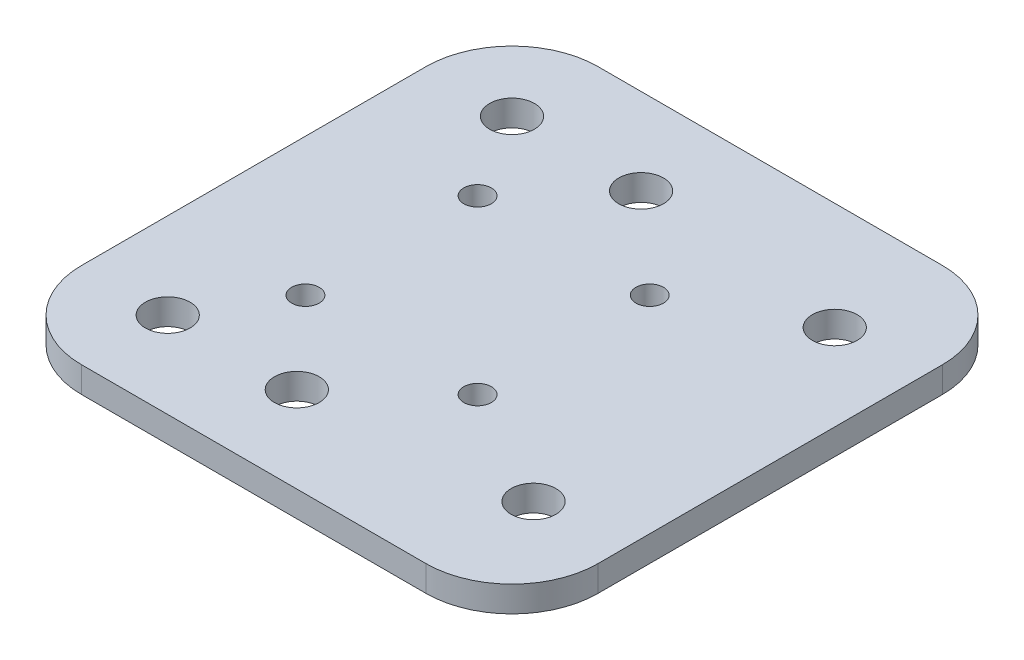
ISO-10303-21;
HEADER;
FILE_DESCRIPTION(('STEP AP214'),'2;1');
FILE_NAME('part.step','',(''),(''),'','','');
FILE_SCHEMA(('AUTOMOTIVE_DESIGN { 1 0 10303 214 1 1 1 1 }'));
ENDSEC;
DATA;
#1=APPLICATION_CONTEXT('core data for automotive mechanical design processes');
#2=APPLICATION_PROTOCOL_DEFINITION('international standard','automotive_design',2000,#1);
#3=PRODUCT_CONTEXT('',#1,'mechanical');
#4=PRODUCT('Part','Part','',(#3));
#5=PRODUCT_RELATED_PRODUCT_CATEGORY('part','',(#4));
#6=PRODUCT_DEFINITION_FORMATION('','',#4);
#7=PRODUCT_DEFINITION_CONTEXT('part definition',#1,'design');
#8=PRODUCT_DEFINITION('design','',#6,#7);
#9=PRODUCT_DEFINITION_SHAPE('','',#8);
#10=(LENGTH_UNIT() NAMED_UNIT(*) SI_UNIT(.MILLI.,.METRE.));
#11=(NAMED_UNIT(*) PLANE_ANGLE_UNIT() SI_UNIT($,.RADIAN.));
#12=(NAMED_UNIT(*) SI_UNIT($,.STERADIAN.) SOLID_ANGLE_UNIT());
#13=UNCERTAINTY_MEASURE_WITH_UNIT(LENGTH_MEASURE(1.E-05),#10,'distance_accuracy_value','');
#14=(GEOMETRIC_REPRESENTATION_CONTEXT(3) GLOBAL_UNCERTAINTY_ASSIGNED_CONTEXT((#13)) GLOBAL_UNIT_ASSIGNED_CONTEXT((#10,
#11,#12)) REPRESENTATION_CONTEXT('',''));
#15=CARTESIAN_POINT('',(0.,0.,0.));
#16=DIRECTION('',(0.,0.,1.));
#17=DIRECTION('',(1.,0.,0.));
#18=AXIS2_PLACEMENT_3D('',#15,#16,#17);
#19=CARTESIAN_POINT('',(0.,3.,-30.));
#20=DIRECTION('',(0.,0.,1.));
#21=DIRECTION('',(1.,0.,0.));
#22=AXIS2_PLACEMENT_3D('',#19,#20,#21);
#23=PLANE('',#22);
#24=DIRECTION('',(-1.,0.,0.));
#25=VECTOR('',#24,1.);
#26=CARTESIAN_POINT('',(21.7157287525381,3.,-30.));
#27=LINE('',#26,#25);
#28=CARTESIAN_POINT('',(50.,3.,-30.));
#29=VERTEX_POINT('',#28);
#30=CARTESIAN_POINT('',(10.,3.,-30.));
#31=VERTEX_POINT('',#30);
#32=EDGE_CURVE('E130',#29,#31,#27,.T.);
#33=ORIENTED_EDGE('',*,*,#32,.F.);
#34=DIRECTION('',(0.,-1.,0.));
#35=VECTOR('',#34,1.);
#36=CARTESIAN_POINT('',(50.,3.,-30.));
#37=LINE('',#36,#35);
#38=CARTESIAN_POINT('',(50.,0.,-30.));
#39=VERTEX_POINT('',#38);
#40=EDGE_CURVE('E156',#29,#39,#37,.T.);
#41=ORIENTED_EDGE('',*,*,#40,.T.);
#42=DIRECTION('',(-1.,0.,0.));
#43=VECTOR('',#42,1.);
#44=CARTESIAN_POINT('',(0.,0.,-30.));
#45=LINE('',#44,#43);
#46=CARTESIAN_POINT('',(10.,0.,-30.));
#47=VERTEX_POINT('',#46);
#48=EDGE_CURVE('E164',#39,#47,#45,.T.);
#49=ORIENTED_EDGE('',*,*,#48,.T.);
#50=DIRECTION('',(0.,-1.,0.));
#51=VECTOR('',#50,1.);
#52=CARTESIAN_POINT('',(10.,3.,-30.));
#53=LINE('',#52,#51);
#54=EDGE_CURVE('E154',#47,#31,#53,.F.);
#55=ORIENTED_EDGE('',*,*,#54,.T.);
#56=EDGE_LOOP('',(#33,#41,#49,#55));
#57=FACE_BOUND('',#56,.T.);
#58=ADVANCED_FACE('F39',(#57),#23,.F.);
#59=CARTESIAN_POINT('',(0.,3.,30.));
#60=DIRECTION('',(1.,0.,0.));
#61=DIRECTION('',(0.,0.,-1.));
#62=AXIS2_PLACEMENT_3D('',#59,#60,#61);
#63=PLANE('',#62);
#64=DIRECTION('',(0.,0.,1.));
#65=VECTOR('',#64,1.);
#66=CARTESIAN_POINT('',(0.,0.,30.));
#67=LINE('',#66,#65);
#68=CARTESIAN_POINT('',(0.,0.,-20.));
#69=VERTEX_POINT('',#68);
#70=CARTESIAN_POINT('',(0.,0.,20.));
#71=VERTEX_POINT('',#70);
#72=EDGE_CURVE('E135',#69,#71,#67,.T.);
#73=ORIENTED_EDGE('',*,*,#72,.T.);
#74=DIRECTION('',(0.,-1.,0.));
#75=VECTOR('',#74,1.);
#76=CARTESIAN_POINT('',(0.,3.,20.));
#77=LINE('',#76,#75);
#78=CARTESIAN_POINT('',(0.,3.,20.));
#79=VERTEX_POINT('',#78);
#80=EDGE_CURVE('E11',#71,#79,#77,.F.);
#81=ORIENTED_EDGE('',*,*,#80,.T.);
#82=DIRECTION('',(0.,0.,1.));
#83=VECTOR('',#82,1.);
#84=CARTESIAN_POINT('',(0.,3.,30.));
#85=LINE('',#84,#83);
#86=CARTESIAN_POINT('',(0.,3.,-20.));
#87=VERTEX_POINT('',#86);
#88=EDGE_CURVE('E133',#87,#79,#85,.T.);
#89=ORIENTED_EDGE('',*,*,#88,.F.);
#90=DIRECTION('',(0.,-1.,0.));
#91=VECTOR('',#90,1.);
#92=CARTESIAN_POINT('',(0.,3.,-20.));
#93=LINE('',#92,#91);
#94=EDGE_CURVE('E47',#87,#69,#93,.T.);
#95=ORIENTED_EDGE('',*,*,#94,.T.);
#96=EDGE_LOOP('',(#73,#81,#89,#95));
#97=FACE_BOUND('',#96,.T.);
#98=ADVANCED_FACE('F161',(#97),#63,.F.);
#99=CARTESIAN_POINT('',(21.7157287525381,3.,30.));
#100=DIRECTION('',(0.,0.,-1.));
#101=DIRECTION('',(-1.,0.,0.));
#102=AXIS2_PLACEMENT_3D('',#99,#100,#101);
#103=PLANE('',#102);
#104=DIRECTION('',(1.,0.,0.));
#105=VECTOR('',#104,1.);
#106=CARTESIAN_POINT('',(21.7157287525381,0.,30.));
#107=LINE('',#106,#105);
#108=CARTESIAN_POINT('',(10.,0.,30.));
#109=VERTEX_POINT('',#108);
#110=CARTESIAN_POINT('',(50.,0.,30.));
#111=VERTEX_POINT('',#110);
#112=EDGE_CURVE('E131',#109,#111,#107,.T.);
#113=ORIENTED_EDGE('',*,*,#112,.T.);
#114=DIRECTION('',(0.,-1.,0.));
#115=VECTOR('',#114,1.);
#116=CARTESIAN_POINT('',(50.,3.,30.));
#117=LINE('',#116,#115);
#118=CARTESIAN_POINT('',(50.,3.,30.));
#119=VERTEX_POINT('',#118);
#120=EDGE_CURVE('E109',#111,#119,#117,.F.);
#121=ORIENTED_EDGE('',*,*,#120,.T.);
#122=DIRECTION('',(1.,0.,0.));
#123=VECTOR('',#122,1.);
#124=CARTESIAN_POINT('',(0.,3.,30.));
#125=LINE('',#124,#123);
#126=CARTESIAN_POINT('',(10.,3.,30.));
#127=VERTEX_POINT('',#126);
#128=EDGE_CURVE('E169',#127,#119,#125,.T.);
#129=ORIENTED_EDGE('',*,*,#128,.F.);
#130=DIRECTION('',(0.,-1.,0.));
#131=VECTOR('',#130,1.);
#132=CARTESIAN_POINT('',(10.,3.,30.));
#133=LINE('',#132,#131);
#134=EDGE_CURVE('E114',#127,#109,#133,.T.);
#135=ORIENTED_EDGE('',*,*,#134,.T.);
#136=EDGE_LOOP('',(#113,#121,#129,#135));
#137=FACE_BOUND('',#136,.T.);
#138=ADVANCED_FACE('F253',(#137),#103,.F.);
#139=CARTESIAN_POINT('',(60.,3.,-30.));
#140=DIRECTION('',(-1.,0.,0.));
#141=DIRECTION('',(0.,0.,1.));
#142=AXIS2_PLACEMENT_3D('',#139,#140,#141);
#143=PLANE('',#142);
#144=DIRECTION('',(0.,0.,-1.));
#145=VECTOR('',#144,1.);
#146=CARTESIAN_POINT('',(60.,3.,-30.));
#147=LINE('',#146,#145);
#148=CARTESIAN_POINT('',(60.,3.,20.));
#149=VERTEX_POINT('',#148);
#150=CARTESIAN_POINT('',(60.,3.,-20.));
#151=VERTEX_POINT('',#150);
#152=EDGE_CURVE('E124',#149,#151,#147,.T.);
#153=ORIENTED_EDGE('',*,*,#152,.F.);
#154=DIRECTION('',(0.,-1.,0.));
#155=VECTOR('',#154,1.);
#156=CARTESIAN_POINT('',(60.,3.,20.));
#157=LINE('',#156,#155);
#158=CARTESIAN_POINT('',(60.,0.,20.));
#159=VERTEX_POINT('',#158);
#160=EDGE_CURVE('E108',#149,#159,#157,.T.);
#161=ORIENTED_EDGE('',*,*,#160,.T.);
#162=DIRECTION('',(0.,0.,-1.));
#163=VECTOR('',#162,1.);
#164=CARTESIAN_POINT('',(60.,0.,-30.));
#165=LINE('',#164,#163);
#166=CARTESIAN_POINT('',(60.,0.,-20.));
#167=VERTEX_POINT('',#166);
#168=EDGE_CURVE('E121',#159,#167,#165,.T.);
#169=ORIENTED_EDGE('',*,*,#168,.T.);
#170=DIRECTION('',(0.,-1.,0.));
#171=VECTOR('',#170,1.);
#172=CARTESIAN_POINT('',(60.,3.,-20.));
#173=LINE('',#172,#171);
#174=EDGE_CURVE('E126',#167,#151,#173,.F.);
#175=ORIENTED_EDGE('',*,*,#174,.T.);
#176=EDGE_LOOP('',(#153,#161,#169,#175));
#177=FACE_BOUND('',#176,.T.);
#178=ADVANCED_FACE('F120',(#177),#143,.F.);
#179=CARTESIAN_POINT('',(0.,3.,0.));
#180=DIRECTION('',(0.,-1.,0.));
#181=DIRECTION('',(0.,0.,-1.));
#182=AXIS2_PLACEMENT_3D('',#179,#180,#181);
#183=PLANE('',#182);
#184=CARTESIAN_POINT('',(25.,3.,20.));
#185=DIRECTION('',(0.,1.,0.));
#186=DIRECTION('',(0.,0.,1.));
#187=AXIS2_PLACEMENT_3D('',#184,#185,#186);
#188=CIRCLE('',#187,2.6);
#189=CARTESIAN_POINT('',(25.,3.,22.6));
#190=VERTEX_POINT('',#189);
#191=EDGE_CURVE('E203',#190,#190,#188,.T.);
#192=ORIENTED_EDGE('',*,*,#191,.F.);
#193=EDGE_LOOP('',(#192));
#194=FACE_BOUND('',#193,.T.);
#195=CARTESIAN_POINT('',(25.,3.,-20.));
#196=DIRECTION('',(0.,1.,0.));
#197=DIRECTION('',(0.,0.,1.));
#198=AXIS2_PLACEMENT_3D('',#195,#196,#197);
#199=CIRCLE('',#198,2.6);
#200=CARTESIAN_POINT('',(25.,3.,-17.4));
#201=VERTEX_POINT('',#200);
#202=EDGE_CURVE('E210',#201,#201,#199,.T.);
#203=ORIENTED_EDGE('',*,*,#202,.F.);
#204=EDGE_LOOP('',(#203));
#205=FACE_BOUND('',#204,.T.);
#206=CARTESIAN_POINT('',(10.,3.,20.));
#207=DIRECTION('',(0.,1.,0.));
#208=DIRECTION('',(0.,0.,1.));
#209=AXIS2_PLACEMENT_3D('',#206,#207,#208);
#210=CIRCLE('',#209,2.6);
#211=CARTESIAN_POINT('',(10.,3.,22.6));
#212=VERTEX_POINT('',#211);
#213=EDGE_CURVE('E216',#212,#212,#210,.T.);
#214=ORIENTED_EDGE('',*,*,#213,.F.);
#215=EDGE_LOOP('',(#214));
#216=FACE_BOUND('',#215,.T.);
#217=CARTESIAN_POINT('',(10.,3.,-20.));
#218=DIRECTION('',(0.,1.,0.));
#219=DIRECTION('',(0.,0.,1.));
#220=AXIS2_PLACEMENT_3D('',#217,#218,#219);
#221=CIRCLE('',#220,2.6);
#222=CARTESIAN_POINT('',(10.,3.,-17.4));
#223=VERTEX_POINT('',#222);
#224=EDGE_CURVE('E222',#223,#223,#221,.T.);
#225=ORIENTED_EDGE('',*,*,#224,.F.);
#226=EDGE_LOOP('',(#225));
#227=FACE_BOUND('',#226,.T.);
#228=CARTESIAN_POINT('',(36.,3.,-10.));
#229=DIRECTION('',(0.,1.,0.));
#230=DIRECTION('',(0.,0.,1.));
#231=AXIS2_PLACEMENT_3D('',#228,#229,#230);
#232=CIRCLE('',#231,1.6);
#233=CARTESIAN_POINT('',(36.,3.,-8.4));
#234=VERTEX_POINT('',#233);
#235=EDGE_CURVE('E186',#234,#234,#232,.T.);
#236=ORIENTED_EDGE('',*,*,#235,.F.);
#237=EDGE_LOOP('',(#236));
#238=FACE_BOUND('',#237,.T.);
#239=CARTESIAN_POINT('',(36.,3.,10.));
#240=DIRECTION('',(0.,1.,0.));
#241=DIRECTION('',(0.,0.,-1.));
#242=AXIS2_PLACEMENT_3D('',#239,#240,#241);
#243=CIRCLE('',#242,1.6);
#244=CARTESIAN_POINT('',(36.,3.,8.4));
#245=VERTEX_POINT('',#244);
#246=EDGE_CURVE('E179',#245,#245,#243,.T.);
#247=ORIENTED_EDGE('',*,*,#246,.F.);
#248=EDGE_LOOP('',(#247));
#249=FACE_BOUND('',#248,.T.);
#250=CARTESIAN_POINT('',(16.,3.,10.));
#251=DIRECTION('',(0.,1.,0.));
#252=DIRECTION('',(0.,0.,-1.));
#253=AXIS2_PLACEMENT_3D('',#250,#251,#252);
#254=CIRCLE('',#253,1.6);
#255=CARTESIAN_POINT('',(16.,3.,8.4));
#256=VERTEX_POINT('',#255);
#257=EDGE_CURVE('E198',#256,#256,#254,.T.);
#258=ORIENTED_EDGE('',*,*,#257,.F.);
#259=EDGE_LOOP('',(#258));
#260=FACE_BOUND('',#259,.T.);
#261=CARTESIAN_POINT('',(50.,3.,-17.5));
#262=DIRECTION('',(0.,1.,0.));
#263=DIRECTION('',(0.,0.,1.));
#264=AXIS2_PLACEMENT_3D('',#261,#262,#263);
#265=CIRCLE('',#264,2.6);
#266=CARTESIAN_POINT('',(50.,3.,-14.9));
#267=VERTEX_POINT('',#266);
#268=EDGE_CURVE('E191',#267,#267,#265,.T.);
#269=ORIENTED_EDGE('',*,*,#268,.F.);
#270=EDGE_LOOP('',(#269));
#271=FACE_BOUND('',#270,.T.);
#272=CARTESIAN_POINT('',(50.,3.,17.5));
#273=DIRECTION('',(0.,1.,0.));
#274=DIRECTION('',(0.,0.,1.));
#275=AXIS2_PLACEMENT_3D('',#272,#273,#274);
#276=CIRCLE('',#275,2.6);
#277=CARTESIAN_POINT('',(50.,3.,20.1));
#278=VERTEX_POINT('',#277);
#279=EDGE_CURVE('E227',#278,#278,#276,.T.);
#280=ORIENTED_EDGE('',*,*,#279,.F.);
#281=EDGE_LOOP('',(#280));
#282=FACE_BOUND('',#281,.T.);
#283=CARTESIAN_POINT('',(16.,3.,-10.));
#284=DIRECTION('',(0.,1.,0.));
#285=DIRECTION('',(0.,0.,1.));
#286=AXIS2_PLACEMENT_3D('',#283,#284,#285);
#287=CIRCLE('',#286,1.6);
#288=CARTESIAN_POINT('',(16.,3.,-8.4));
#289=VERTEX_POINT('',#288);
#290=EDGE_CURVE('E173',#289,#289,#287,.T.);
#291=ORIENTED_EDGE('',*,*,#290,.F.);
#292=EDGE_LOOP('',(#291));
#293=FACE_BOUND('',#292,.T.);
#294=ORIENTED_EDGE('',*,*,#128,.T.);
#295=CARTESIAN_POINT('',(50.,3.,20.));
#296=DIRECTION('',(0.,-1.,0.));
#297=DIRECTION('',(0.,0.,-1.));
#298=AXIS2_PLACEMENT_3D('',#295,#296,#297);
#299=CIRCLE('',#298,10.);
#300=EDGE_CURVE('E152',#119,#149,#299,.F.);
#301=ORIENTED_EDGE('',*,*,#300,.T.);
#302=ORIENTED_EDGE('',*,*,#152,.T.);
#303=CARTESIAN_POINT('',(50.,3.,-20.));
#304=DIRECTION('',(0.,-1.,0.));
#305=DIRECTION('',(0.,0.,-1.));
#306=AXIS2_PLACEMENT_3D('',#303,#304,#305);
#307=CIRCLE('',#306,10.);
#308=EDGE_CURVE('E150',#151,#29,#307,.F.);
#309=ORIENTED_EDGE('',*,*,#308,.T.);
#310=ORIENTED_EDGE('',*,*,#32,.T.);
#311=CARTESIAN_POINT('',(10.,3.,-20.));
#312=DIRECTION('',(0.,-1.,0.));
#313=DIRECTION('',(0.,0.,-1.));
#314=AXIS2_PLACEMENT_3D('',#311,#312,#313);
#315=CIRCLE('',#314,10.);
#316=EDGE_CURVE('E59',#31,#87,#315,.F.);
#317=ORIENTED_EDGE('',*,*,#316,.T.);
#318=ORIENTED_EDGE('',*,*,#88,.T.);
#319=CARTESIAN_POINT('',(10.,3.,20.));
#320=DIRECTION('',(0.,-1.,0.));
#321=DIRECTION('',(0.,0.,-1.));
#322=AXIS2_PLACEMENT_3D('',#319,#320,#321);
#323=CIRCLE('',#322,10.);
#324=EDGE_CURVE('E148',#79,#127,#323,.F.);
#325=ORIENTED_EDGE('',*,*,#324,.T.);
#326=EDGE_LOOP('',(#294,#301,#302,#309,#310,#317,#318,#325));
#327=FACE_BOUND('',#326,.T.);
#328=ADVANCED_FACE('F243',(#194,#205,#216,#227,#238,#249,#260,#271,#282,#293,#327),#183,.F.);
#329=CARTESIAN_POINT('',(0.,0.,0.));
#330=DIRECTION('',(0.,-1.,0.));
#331=DIRECTION('',(0.,0.,-1.));
#332=AXIS2_PLACEMENT_3D('',#329,#330,#331);
#333=PLANE('',#332);
#334=CARTESIAN_POINT('',(25.,0.,20.));
#335=DIRECTION('',(0.,1.,0.));
#336=DIRECTION('',(0.,0.,1.));
#337=AXIS2_PLACEMENT_3D('',#334,#335,#336);
#338=CIRCLE('',#337,2.6);
#339=CARTESIAN_POINT('',(25.,0.,22.6));
#340=VERTEX_POINT('',#339);
#341=EDGE_CURVE('E206',#340,#340,#338,.T.);
#342=ORIENTED_EDGE('',*,*,#341,.T.);
#343=EDGE_LOOP('',(#342));
#344=FACE_BOUND('',#343,.T.);
#345=CARTESIAN_POINT('',(25.,0.,-20.));
#346=DIRECTION('',(0.,1.,0.));
#347=DIRECTION('',(0.,0.,1.));
#348=AXIS2_PLACEMENT_3D('',#345,#346,#347);
#349=CIRCLE('',#348,2.6);
#350=CARTESIAN_POINT('',(25.,0.,-17.4));
#351=VERTEX_POINT('',#350);
#352=EDGE_CURVE('E213',#351,#351,#349,.T.);
#353=ORIENTED_EDGE('',*,*,#352,.T.);
#354=EDGE_LOOP('',(#353));
#355=FACE_BOUND('',#354,.T.);
#356=CARTESIAN_POINT('',(10.,0.,20.));
#357=DIRECTION('',(0.,1.,0.));
#358=DIRECTION('',(0.,0.,1.));
#359=AXIS2_PLACEMENT_3D('',#356,#357,#358);
#360=CIRCLE('',#359,2.6);
#361=CARTESIAN_POINT('',(10.,0.,22.6));
#362=VERTEX_POINT('',#361);
#363=EDGE_CURVE('E219',#362,#362,#360,.T.);
#364=ORIENTED_EDGE('',*,*,#363,.T.);
#365=EDGE_LOOP('',(#364));
#366=FACE_BOUND('',#365,.T.);
#367=CARTESIAN_POINT('',(10.,0.,-20.));
#368=DIRECTION('',(0.,1.,0.));
#369=DIRECTION('',(0.,0.,1.));
#370=AXIS2_PLACEMENT_3D('',#367,#368,#369);
#371=CIRCLE('',#370,2.6);
#372=CARTESIAN_POINT('',(10.,0.,-17.4));
#373=VERTEX_POINT('',#372);
#374=EDGE_CURVE('E195',#373,#373,#371,.T.);
#375=ORIENTED_EDGE('',*,*,#374,.T.);
#376=EDGE_LOOP('',(#375));
#377=FACE_BOUND('',#376,.T.);
#378=CARTESIAN_POINT('',(36.,0.,-10.));
#379=DIRECTION('',(0.,1.,0.));
#380=DIRECTION('',(0.,0.,1.));
#381=AXIS2_PLACEMENT_3D('',#378,#379,#380);
#382=CIRCLE('',#381,1.6);
#383=CARTESIAN_POINT('',(36.,0.,-8.4));
#384=VERTEX_POINT('',#383);
#385=EDGE_CURVE('E176',#384,#384,#382,.T.);
#386=ORIENTED_EDGE('',*,*,#385,.T.);
#387=EDGE_LOOP('',(#386));
#388=FACE_BOUND('',#387,.T.);
#389=CARTESIAN_POINT('',(36.,0.,10.));
#390=DIRECTION('',(0.,1.,0.));
#391=DIRECTION('',(0.,0.,-1.));
#392=AXIS2_PLACEMENT_3D('',#389,#390,#391);
#393=CIRCLE('',#392,1.6);
#394=CARTESIAN_POINT('',(36.,0.,8.4));
#395=VERTEX_POINT('',#394);
#396=EDGE_CURVE('E182',#395,#395,#393,.T.);
#397=ORIENTED_EDGE('',*,*,#396,.T.);
#398=EDGE_LOOP('',(#397));
#399=FACE_BOUND('',#398,.T.);
#400=CARTESIAN_POINT('',(16.,0.,10.));
#401=DIRECTION('',(0.,1.,0.));
#402=DIRECTION('',(0.,0.,-1.));
#403=AXIS2_PLACEMENT_3D('',#400,#401,#402);
#404=CIRCLE('',#403,1.6);
#405=CARTESIAN_POINT('',(16.,0.,8.4));
#406=VERTEX_POINT('',#405);
#407=EDGE_CURVE('E183',#406,#406,#404,.T.);
#408=ORIENTED_EDGE('',*,*,#407,.T.);
#409=EDGE_LOOP('',(#408));
#410=FACE_BOUND('',#409,.T.);
#411=CARTESIAN_POINT('',(50.,0.,-17.5));
#412=DIRECTION('',(0.,1.,0.));
#413=DIRECTION('',(0.,0.,1.));
#414=AXIS2_PLACEMENT_3D('',#411,#412,#413);
#415=CIRCLE('',#414,2.6);
#416=CARTESIAN_POINT('',(50.,0.,-14.9));
#417=VERTEX_POINT('',#416);
#418=EDGE_CURVE('E194',#417,#417,#415,.T.);
#419=ORIENTED_EDGE('',*,*,#418,.T.);
#420=EDGE_LOOP('',(#419));
#421=FACE_BOUND('',#420,.T.);
#422=CARTESIAN_POINT('',(50.,0.,17.5));
#423=DIRECTION('',(0.,1.,0.));
#424=DIRECTION('',(0.,0.,1.));
#425=AXIS2_PLACEMENT_3D('',#422,#423,#424);
#426=CIRCLE('',#425,2.6);
#427=CARTESIAN_POINT('',(50.,0.,20.1));
#428=VERTEX_POINT('',#427);
#429=EDGE_CURVE('E207',#428,#428,#426,.T.);
#430=ORIENTED_EDGE('',*,*,#429,.T.);
#431=EDGE_LOOP('',(#430));
#432=FACE_BOUND('',#431,.T.);
#433=CARTESIAN_POINT('',(16.,0.,-10.));
#434=DIRECTION('',(0.,1.,0.));
#435=DIRECTION('',(0.,0.,1.));
#436=AXIS2_PLACEMENT_3D('',#433,#434,#435);
#437=CIRCLE('',#436,1.6);
#438=CARTESIAN_POINT('',(16.,0.,-8.4));
#439=VERTEX_POINT('',#438);
#440=EDGE_CURVE('E165',#439,#439,#437,.T.);
#441=ORIENTED_EDGE('',*,*,#440,.T.);
#442=EDGE_LOOP('',(#441));
#443=FACE_BOUND('',#442,.T.);
#444=ORIENTED_EDGE('',*,*,#168,.F.);
#445=CARTESIAN_POINT('',(50.,0.,20.));
#446=DIRECTION('',(0.,-1.,0.));
#447=DIRECTION('',(0.,0.,-1.));
#448=AXIS2_PLACEMENT_3D('',#445,#446,#447);
#449=CIRCLE('',#448,10.);
#450=EDGE_CURVE('E104',#159,#111,#449,.T.);
#451=ORIENTED_EDGE('',*,*,#450,.T.);
#452=ORIENTED_EDGE('',*,*,#112,.F.);
#453=CARTESIAN_POINT('',(10.,0.,20.));
#454=DIRECTION('',(0.,-1.,0.));
#455=DIRECTION('',(0.,0.,-1.));
#456=AXIS2_PLACEMENT_3D('',#453,#454,#455);
#457=CIRCLE('',#456,10.);
#458=EDGE_CURVE('E141',#109,#71,#457,.T.);
#459=ORIENTED_EDGE('',*,*,#458,.T.);
#460=ORIENTED_EDGE('',*,*,#72,.F.);
#461=CARTESIAN_POINT('',(10.,0.,-20.));
#462=DIRECTION('',(0.,-1.,0.));
#463=DIRECTION('',(0.,0.,-1.));
#464=AXIS2_PLACEMENT_3D('',#461,#462,#463);
#465=CIRCLE('',#464,10.);
#466=EDGE_CURVE('E125',#69,#47,#465,.T.);
#467=ORIENTED_EDGE('',*,*,#466,.T.);
#468=ORIENTED_EDGE('',*,*,#48,.F.);
#469=CARTESIAN_POINT('',(50.,0.,-20.));
#470=DIRECTION('',(0.,-1.,0.));
#471=DIRECTION('',(0.,0.,-1.));
#472=AXIS2_PLACEMENT_3D('',#469,#470,#471);
#473=CIRCLE('',#472,10.);
#474=EDGE_CURVE('E115',#39,#167,#473,.T.);
#475=ORIENTED_EDGE('',*,*,#474,.T.);
#476=EDGE_LOOP('',(#444,#451,#452,#459,#460,#467,#468,#475));
#477=FACE_BOUND('',#476,.T.);
#478=ADVANCED_FACE('F128',(#344,#355,#366,#377,#388,#399,#410,#421,#432,#443,#477),#333,.T.);
#479=CARTESIAN_POINT('',(16.,0.,-10.));
#480=DIRECTION('',(0.,1.,0.));
#481=DIRECTION('',(0.,0.,1.));
#482=AXIS2_PLACEMENT_3D('',#479,#480,#481);
#483=CYLINDRICAL_SURFACE('',#482,1.6);
#484=ORIENTED_EDGE('',*,*,#440,.F.);
#485=EDGE_LOOP('',(#484));
#486=FACE_BOUND('',#485,.T.);
#487=ORIENTED_EDGE('',*,*,#290,.T.);
#488=EDGE_LOOP('',(#487));
#489=FACE_BOUND('',#488,.T.);
#490=ADVANCED_FACE('F239',(#486,#489),#483,.F.);
#491=CARTESIAN_POINT('',(50.,0.,17.5));
#492=DIRECTION('',(0.,1.,0.));
#493=DIRECTION('',(0.,0.,1.));
#494=AXIS2_PLACEMENT_3D('',#491,#492,#493);
#495=CYLINDRICAL_SURFACE('',#494,2.6);
#496=ORIENTED_EDGE('',*,*,#429,.F.);
#497=EDGE_LOOP('',(#496));
#498=FACE_BOUND('',#497,.T.);
#499=ORIENTED_EDGE('',*,*,#279,.T.);
#500=EDGE_LOOP('',(#499));
#501=FACE_BOUND('',#500,.T.);
#502=ADVANCED_FACE('F235',(#498,#501),#495,.F.);
#503=CARTESIAN_POINT('',(50.,0.,-17.5));
#504=DIRECTION('',(0.,1.,0.));
#505=DIRECTION('',(0.,0.,1.));
#506=AXIS2_PLACEMENT_3D('',#503,#504,#505);
#507=CYLINDRICAL_SURFACE('',#506,2.6);
#508=ORIENTED_EDGE('',*,*,#418,.F.);
#509=EDGE_LOOP('',(#508));
#510=FACE_BOUND('',#509,.T.);
#511=ORIENTED_EDGE('',*,*,#268,.T.);
#512=EDGE_LOOP('',(#511));
#513=FACE_BOUND('',#512,.T.);
#514=ADVANCED_FACE('F238',(#510,#513),#507,.F.);
#515=CARTESIAN_POINT('',(16.,0.,10.));
#516=DIRECTION('',(0.,1.,0.));
#517=DIRECTION('',(0.,0.,1.));
#518=AXIS2_PLACEMENT_3D('',#515,#516,#517);
#519=CYLINDRICAL_SURFACE('',#518,1.6);
#520=ORIENTED_EDGE('',*,*,#407,.F.);
#521=EDGE_LOOP('',(#520));
#522=FACE_BOUND('',#521,.T.);
#523=ORIENTED_EDGE('',*,*,#257,.T.);
#524=EDGE_LOOP('',(#523));
#525=FACE_BOUND('',#524,.T.);
#526=ADVANCED_FACE('F293',(#522,#525),#519,.F.);
#527=CARTESIAN_POINT('',(36.,0.,10.));
#528=DIRECTION('',(0.,1.,0.));
#529=DIRECTION('',(0.,0.,1.));
#530=AXIS2_PLACEMENT_3D('',#527,#528,#529);
#531=CYLINDRICAL_SURFACE('',#530,1.6);
#532=ORIENTED_EDGE('',*,*,#396,.F.);
#533=EDGE_LOOP('',(#532));
#534=FACE_BOUND('',#533,.T.);
#535=ORIENTED_EDGE('',*,*,#246,.T.);
#536=EDGE_LOOP('',(#535));
#537=FACE_BOUND('',#536,.T.);
#538=ADVANCED_FACE('F296',(#534,#537),#531,.F.);
#539=CARTESIAN_POINT('',(36.,0.,-10.));
#540=DIRECTION('',(0.,1.,0.));
#541=DIRECTION('',(0.,0.,1.));
#542=AXIS2_PLACEMENT_3D('',#539,#540,#541);
#543=CYLINDRICAL_SURFACE('',#542,1.6);
#544=ORIENTED_EDGE('',*,*,#385,.F.);
#545=EDGE_LOOP('',(#544));
#546=FACE_BOUND('',#545,.T.);
#547=ORIENTED_EDGE('',*,*,#235,.T.);
#548=EDGE_LOOP('',(#547));
#549=FACE_BOUND('',#548,.T.);
#550=ADVANCED_FACE('F301',(#546,#549),#543,.F.);
#551=CARTESIAN_POINT('',(10.,0.,-20.));
#552=DIRECTION('',(0.,1.,0.));
#553=DIRECTION('',(0.,0.,1.));
#554=AXIS2_PLACEMENT_3D('',#551,#552,#553);
#555=CYLINDRICAL_SURFACE('',#554,2.6);
#556=ORIENTED_EDGE('',*,*,#374,.F.);
#557=EDGE_LOOP('',(#556));
#558=FACE_BOUND('',#557,.T.);
#559=ORIENTED_EDGE('',*,*,#224,.T.);
#560=EDGE_LOOP('',(#559));
#561=FACE_BOUND('',#560,.T.);
#562=ADVANCED_FACE('F304',(#558,#561),#555,.F.);
#563=CARTESIAN_POINT('',(10.,0.,20.));
#564=DIRECTION('',(0.,1.,0.));
#565=DIRECTION('',(0.,0.,1.));
#566=AXIS2_PLACEMENT_3D('',#563,#564,#565);
#567=CYLINDRICAL_SURFACE('',#566,2.6);
#568=ORIENTED_EDGE('',*,*,#363,.F.);
#569=EDGE_LOOP('',(#568));
#570=FACE_BOUND('',#569,.T.);
#571=ORIENTED_EDGE('',*,*,#213,.T.);
#572=EDGE_LOOP('',(#571));
#573=FACE_BOUND('',#572,.T.);
#574=ADVANCED_FACE('F286',(#570,#573),#567,.F.);
#575=CARTESIAN_POINT('',(25.,0.,-20.));
#576=DIRECTION('',(0.,1.,0.));
#577=DIRECTION('',(0.,0.,1.));
#578=AXIS2_PLACEMENT_3D('',#575,#576,#577);
#579=CYLINDRICAL_SURFACE('',#578,2.6);
#580=ORIENTED_EDGE('',*,*,#352,.F.);
#581=EDGE_LOOP('',(#580));
#582=FACE_BOUND('',#581,.T.);
#583=ORIENTED_EDGE('',*,*,#202,.T.);
#584=EDGE_LOOP('',(#583));
#585=FACE_BOUND('',#584,.T.);
#586=ADVANCED_FACE('F280',(#582,#585),#579,.F.);
#587=CARTESIAN_POINT('',(25.,0.,20.));
#588=DIRECTION('',(0.,1.,0.));
#589=DIRECTION('',(0.,0.,1.));
#590=AXIS2_PLACEMENT_3D('',#587,#588,#589);
#591=CYLINDRICAL_SURFACE('',#590,2.6);
#592=ORIENTED_EDGE('',*,*,#341,.F.);
#593=EDGE_LOOP('',(#592));
#594=FACE_BOUND('',#593,.T.);
#595=ORIENTED_EDGE('',*,*,#191,.T.);
#596=EDGE_LOOP('',(#595));
#597=FACE_BOUND('',#596,.T.);
#598=ADVANCED_FACE('F276',(#594,#597),#591,.F.);
#599=CARTESIAN_POINT('',(50.,3.,20.));
#600=DIRECTION('',(0.,-1.,0.));
#601=DIRECTION('',(0.,0.,-1.));
#602=AXIS2_PLACEMENT_3D('',#599,#600,#601);
#603=CYLINDRICAL_SURFACE('',#602,10.);
#604=ORIENTED_EDGE('',*,*,#300,.F.);
#605=ORIENTED_EDGE('',*,*,#120,.F.);
#606=ORIENTED_EDGE('',*,*,#450,.F.);
#607=ORIENTED_EDGE('',*,*,#160,.F.);
#608=EDGE_LOOP('',(#604,#605,#606,#607));
#609=FACE_BOUND('',#608,.T.);
#610=ADVANCED_FACE('F107',(#609),#603,.T.);
#611=CARTESIAN_POINT('',(50.,3.,-20.));
#612=DIRECTION('',(0.,-1.,0.));
#613=DIRECTION('',(0.,0.,-1.));
#614=AXIS2_PLACEMENT_3D('',#611,#612,#613);
#615=CYLINDRICAL_SURFACE('',#614,10.);
#616=ORIENTED_EDGE('',*,*,#308,.F.);
#617=ORIENTED_EDGE('',*,*,#174,.F.);
#618=ORIENTED_EDGE('',*,*,#474,.F.);
#619=ORIENTED_EDGE('',*,*,#40,.F.);
#620=EDGE_LOOP('',(#616,#617,#618,#619));
#621=FACE_BOUND('',#620,.T.);
#622=ADVANCED_FACE('F257',(#621),#615,.T.);
#623=CARTESIAN_POINT('',(10.,3.,20.));
#624=DIRECTION('',(0.,-1.,0.));
#625=DIRECTION('',(0.,0.,-1.));
#626=AXIS2_PLACEMENT_3D('',#623,#624,#625);
#627=CYLINDRICAL_SURFACE('',#626,10.);
#628=ORIENTED_EDGE('',*,*,#324,.F.);
#629=ORIENTED_EDGE('',*,*,#80,.F.);
#630=ORIENTED_EDGE('',*,*,#458,.F.);
#631=ORIENTED_EDGE('',*,*,#134,.F.);
#632=EDGE_LOOP('',(#628,#629,#630,#631));
#633=FACE_BOUND('',#632,.T.);
#634=ADVANCED_FACE('F255',(#633),#627,.T.);
#635=CARTESIAN_POINT('',(10.,3.,-20.));
#636=DIRECTION('',(0.,-1.,0.));
#637=DIRECTION('',(0.,0.,-1.));
#638=AXIS2_PLACEMENT_3D('',#635,#636,#637);
#639=CYLINDRICAL_SURFACE('',#638,10.);
#640=ORIENTED_EDGE('',*,*,#316,.F.);
#641=ORIENTED_EDGE('',*,*,#54,.F.);
#642=ORIENTED_EDGE('',*,*,#466,.F.);
#643=ORIENTED_EDGE('',*,*,#94,.F.);
#644=EDGE_LOOP('',(#640,#641,#642,#643));
#645=FACE_BOUND('',#644,.T.);
#646=ADVANCED_FACE('F41',(#645),#639,.T.);
#647=CLOSED_SHELL('',(#58,#98,#138,#178,#328,#478,#490,#502,#514,#526,#538,#550,#562,#574,#586,
#598,#610,#622,#634,#646));
#648=MANIFOLD_SOLID_BREP('B2',#647);
#649=ADVANCED_BREP_SHAPE_REPRESENTATION('',(#18,#648),#14);
#650=SHAPE_DEFINITION_REPRESENTATION(#9,#649);
ENDSEC;
END-ISO-10303-21;
